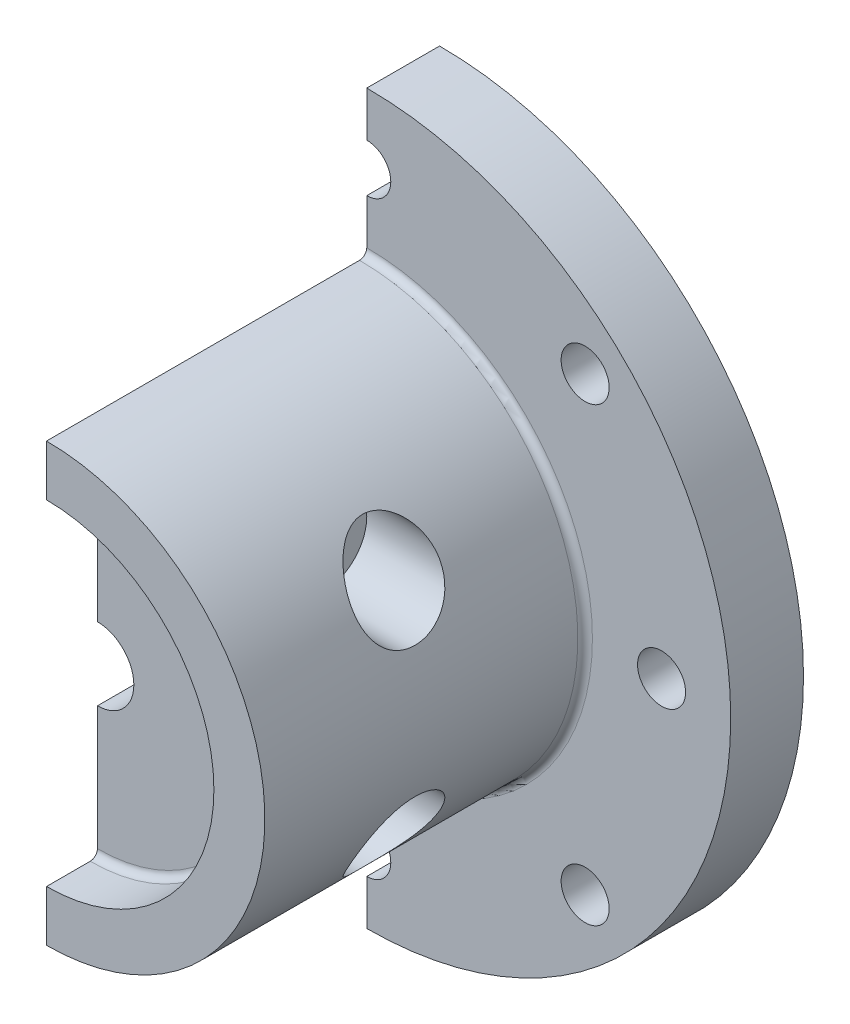
ISO-10303-21;
HEADER;
FILE_DESCRIPTION(('STEP AP214'),'2;1');
FILE_NAME('part.step','',(''),(''),'','','');
FILE_SCHEMA(('AUTOMOTIVE_DESIGN { 1 0 10303 214 1 1 1 1 }'));
ENDSEC;
DATA;
#1=APPLICATION_CONTEXT('core data for automotive mechanical design processes');
#2=APPLICATION_PROTOCOL_DEFINITION('international standard','automotive_design',2000,#1);
#3=PRODUCT_CONTEXT('',#1,'mechanical');
#4=PRODUCT('Part','Part','',(#3));
#5=PRODUCT_RELATED_PRODUCT_CATEGORY('part','',(#4));
#6=PRODUCT_DEFINITION_FORMATION('','',#4);
#7=PRODUCT_DEFINITION_CONTEXT('part definition',#1,'design');
#8=PRODUCT_DEFINITION('design','',#6,#7);
#9=PRODUCT_DEFINITION_SHAPE('','',#8);
#10=(LENGTH_UNIT() NAMED_UNIT(*) SI_UNIT(.MILLI.,.METRE.));
#11=(NAMED_UNIT(*) PLANE_ANGLE_UNIT() SI_UNIT($,.RADIAN.));
#12=(NAMED_UNIT(*) SI_UNIT($,.STERADIAN.) SOLID_ANGLE_UNIT());
#13=UNCERTAINTY_MEASURE_WITH_UNIT(LENGTH_MEASURE(1.E-05),#10,'distance_accuracy_value','');
#14=(GEOMETRIC_REPRESENTATION_CONTEXT(3) GLOBAL_UNCERTAINTY_ASSIGNED_CONTEXT((#13)) GLOBAL_UNIT_ASSIGNED_CONTEXT((#10,
#11,#12)) REPRESENTATION_CONTEXT('',''));
#15=CARTESIAN_POINT('',(0.,0.,0.));
#16=DIRECTION('',(0.,0.,1.));
#17=DIRECTION('',(1.,0.,0.));
#18=AXIS2_PLACEMENT_3D('',#15,#16,#17);
#19=CARTESIAN_POINT('',(0.,0.,22.));
#20=DIRECTION('',(0.,0.,-1.));
#21=DIRECTION('',(-1.,0.,0.));
#22=AXIS2_PLACEMENT_3D('',#19,#20,#21);
#23=CYLINDRICAL_SURFACE('',#22,15.);
#24=CARTESIAN_POINT('',(12.9903810567666,-7.5,8.));
#25=CARTESIAN_POINT('',(12.9264696091976,-7.61069865809604,7.99999904223033));
#26=CARTESIAN_POINT('',(12.8611447439549,-7.72056662722097,8.00612698311182));
#27=CARTESIAN_POINT('',(12.7282674607321,-7.93772137066509,8.0300942720911));
#28=CARTESIAN_POINT('',(12.6607137556231,-8.04500658936455,8.04794050390693));
#29=CARTESIAN_POINT('',(12.5239400195662,-8.25631894895201,8.0948799783041));
#30=CARTESIAN_POINT('',(12.4547167336951,-8.36033863067039,8.12399719441601));
#31=CARTESIAN_POINT('',(12.3154262096252,-8.56420031644843,8.1930326451005));
#32=CARTESIAN_POINT('',(12.2453586497343,-8.66404065878371,8.23295512967083));
#33=CARTESIAN_POINT('',(12.1119652707952,-8.84940869640308,8.31886342067213));
#34=CARTESIAN_POINT('',(12.0486440869453,-8.93538582322869,8.3638868289525));
#35=CARTESIAN_POINT('',(11.9226224737001,-9.10286185968748,8.46223155120769));
#36=CARTESIAN_POINT('',(11.859921976043,-9.1843612663605,8.51555194166533));
#37=CARTESIAN_POINT('',(11.6739073416291,-9.42124636718512,8.68767168482254));
#38=CARTESIAN_POINT('',(11.5523697407225,-9.56944588896759,8.81882645659967));
#39=CARTESIAN_POINT('',(11.3499893329127,-9.80795705894708,9.07742805522252));
#40=CARTESIAN_POINT('',(11.2664601600767,-9.90356447235861,9.19794758181675));
#41=CARTESIAN_POINT('',(11.1109238810263,-10.0777438857431,9.4574198087656));
#42=CARTESIAN_POINT('',(11.0388994161505,-10.1563416152798,9.59634414866977));
#43=CARTESIAN_POINT('',(10.9259369507483,-10.2776091093912,9.85936259114886));
#44=CARTESIAN_POINT('',(10.8816448396185,-10.3243749559963,9.98011254517485));
#45=CARTESIAN_POINT('',(10.8068816805062,-10.4026078769306,10.2305669937711));
#46=CARTESIAN_POINT('',(10.7763981004192,-10.4340888251323,10.3602632453147));
#47=CARTESIAN_POINT('',(10.7320081568901,-10.4797453743423,10.6265409946281));
#48=CARTESIAN_POINT('',(10.7182252431182,-10.4937921217714,10.7631660808401));
#49=CARTESIAN_POINT('',(10.7093013750171,-10.5029005467659,11.0376429123982));
#50=CARTESIAN_POINT('',(10.7141530050185,-10.4979697764865,11.17549414801));
#51=CARTESIAN_POINT('',(10.740288876905,-10.4712204824508,11.4319550281922));
#52=CARTESIAN_POINT('',(10.7596576858874,-10.4513697413144,11.5509810575344));
#53=CARTESIAN_POINT('',(10.8108498055628,-10.3984073931487,11.7832256337995));
#54=CARTESIAN_POINT('',(10.8426790909403,-10.3652894244271,11.8964413652375));
#55=CARTESIAN_POINT('',(10.9292144282833,-10.2741138227659,12.1526320359344));
#56=CARTESIAN_POINT('',(10.9880210294064,-10.2114013081412,12.2925605524142));
#57=CARTESIAN_POINT('',(11.1187585261655,-10.0688920270304,12.5567380768898));
#58=CARTESIAN_POINT('',(11.1907168424405,-9.98905950478929,12.6809533905421));
#59=CARTESIAN_POINT('',(11.3673760915886,-9.78804120627083,12.9496648150922));
#60=CARTESIAN_POINT('',(11.4752547823414,-9.66174777199417,13.0882420786634));
#61=CARTESIAN_POINT('',(11.6987595212769,-9.38989418393816,13.3371615783064));
#62=CARTESIAN_POINT('',(11.8143911370543,-9.2443201094048,13.4474832431815));
#63=CARTESIAN_POINT('',(12.0501678271282,-8.93486670731077,13.6410114260369));
#64=CARTESIAN_POINT('',(12.1703553769613,-8.770734030787,13.7237609405815));
#65=CARTESIAN_POINT('',(12.4092819864776,-8.42930745469143,13.858337004334));
#66=CARTESIAN_POINT('',(12.5280209800095,-8.25201295665694,13.9101621464536));
#67=CARTESIAN_POINT('',(12.7712641294712,-7.8708438522271,13.9838569089806));
#68=CARTESIAN_POINT('',(12.8953037004839,-7.66602078155735,14.0025566887012));
#69=CARTESIAN_POINT('',(13.0735667233716,-7.35502007481257,13.9982949504227));
#70=CARTESIAN_POINT('',(13.131718420433,-7.25066657941244,13.9914763773636));
#71=CARTESIAN_POINT('',(13.2449645987318,-7.04165978786301,13.9666439684654));
#72=CARTESIAN_POINT('',(13.3000610565447,-6.93700673271403,13.9486374648698));
#73=CARTESIAN_POINT('',(13.4018858206176,-6.73801217195145,13.9032441526991));
#74=CARTESIAN_POINT('',(13.4489196182572,-6.64359766220074,13.876858198747));
#75=CARTESIAN_POINT('',(13.5397419788571,-6.4564842157546,13.814390446123));
#76=CARTESIAN_POINT('',(13.5835324315613,-6.36378430404826,13.7783143510454));
#77=CARTESIAN_POINT('',(13.6675860423887,-6.18119644199398,13.6964350008791));
#78=CARTESIAN_POINT('',(13.707851476094,-6.09130670199598,13.6506380874665));
#79=CARTESIAN_POINT('',(13.7846543081797,-5.91544663532723,13.5494075294572));
#80=CARTESIAN_POINT('',(13.8211923269433,-5.82947565774778,13.4939754926766));
#81=CARTESIAN_POINT('',(13.8855768478133,-5.674223571749,13.3820969949688));
#82=CARTESIAN_POINT('',(13.9139261648006,-5.60428042547975,13.3268552438064));
#83=CARTESIAN_POINT('',(13.9676646699947,-5.46897079190085,13.2097342239032));
#84=CARTESIAN_POINT('',(13.9930542531375,-5.4036036944462,13.1478558428503));
#85=CARTESIAN_POINT('',(14.040830387683,-5.27821787042278,13.0178775869065));
#86=CARTESIAN_POINT('',(14.0632181870195,-5.21819692480016,12.9497803173161));
#87=CARTESIAN_POINT('',(14.1049926506369,-5.10420096553406,12.8078836514111));
#88=CARTESIAN_POINT('',(14.1243795046361,-5.05022556975356,12.7340846160019));
#89=CARTESIAN_POINT('',(14.1747574746296,-4.90772473991206,12.5191031908782));
#90=CARTESIAN_POINT('',(14.2023612796171,-4.82680613555144,12.371936734125));
#91=CARTESIAN_POINT('',(14.2480040905256,-4.69037361165972,12.065004393166));
#92=CARTESIAN_POINT('',(14.2660456447429,-4.63485292423952,11.905241878803));
#93=CARTESIAN_POINT('',(14.2923842734037,-4.55296962672859,11.5842669004372));
#94=CARTESIAN_POINT('',(14.3010313937239,-4.52556188534374,11.4233497500116));
#95=CARTESIAN_POINT('',(14.3099710294905,-4.49721708701322,11.0989804012515));
#96=CARTESIAN_POINT('',(14.3102642882491,-4.49627767496139,10.9355284297559));
#97=CARTESIAN_POINT('',(14.3025484779499,-4.52075874821271,10.6126419091109));
#98=CARTESIAN_POINT('',(14.2946313796176,-4.54588722741146,10.4531829125257));
#99=CARTESIAN_POINT('',(14.2704790596761,-4.62114422424302,10.1409444352998));
#100=CARTESIAN_POINT('',(14.2542441152416,-4.67127190882812,9.98816473226973));
#101=CARTESIAN_POINT('',(14.2131528215429,-4.79484194778865,9.69319250174782));
#102=CARTESIAN_POINT('',(14.1882773112151,-4.86833608799118,9.55102436459247));
#103=CARTESIAN_POINT('',(14.1296665451282,-5.03590824512795,9.28144123409604));
#104=CARTESIAN_POINT('',(14.0959313974867,-5.12998601086991,9.15402606074619));
#105=CARTESIAN_POINT('',(14.0188237473157,-5.33713133707824,8.91494578438045));
#106=CARTESIAN_POINT('',(13.9752931393476,-5.45050200504067,8.80359481032328));
#107=CARTESIAN_POINT('',(13.8790968249736,-5.69099518890866,8.60163031973628));
#108=CARTESIAN_POINT('',(13.8264284543281,-5.81812171144236,8.51102286918586));
#109=CARTESIAN_POINT('',(13.7097707158941,-6.08808585764112,8.34811131894618));
#110=CARTESIAN_POINT('',(13.6453657656456,-6.23138098605486,8.2768669552573));
#111=CARTESIAN_POINT('',(13.5080324859417,-6.5237342005856,8.15891771930024));
#112=CARTESIAN_POINT('',(13.4351071626084,-6.6727902418152,8.11220422392469));
#113=CARTESIAN_POINT('',(13.3009269745159,-6.93552204463718,8.05130411024427));
#114=CARTESIAN_POINT('',(13.2412387363235,-7.04884277300181,8.03193324697216));
#115=CARTESIAN_POINT('',(13.1183103333277,-7.27505937830618,8.0062808041133));
#116=CARTESIAN_POINT('',(13.0550696961819,-7.38795519660852,8.00000096941658));
#117=CARTESIAN_POINT('',(12.9903810567666,-7.5,8.));
#118=B_SPLINE_CURVE_WITH_KNOTS('',3,(#24,#25,#26,#27,#28,#29,#30,#31,#32,#33,#34,#35,#36,#37,
#38,#39,#40,#41,#42,#43,#44,#45,#46,#47,#48,#49,#50,#51,#52,#53,#54,#55,#56,#57,#58,#59,#60,#61,
#62,#63,#64,#65,#66,#67,#68,#69,#70,#71,#72,#73,#74,#75,#76,#77,#78,#79,#80,#81,#82,#83,#84,#85,
#86,#87,#88,#89,#90,#91,#92,#93,#94,#95,#96,#97,#98,#99,#100,#101,#102,#103,#104,#105,#106,#107,
#108,#109,#110,#111,#112,#113,#114,#115,#116,#117),.UNSPECIFIED.,.T.,.F.,(4,2,2,2,2,2,2,2,2,2,2,
2,2,2,2,2,2,2,2,2,2,2,2,2,2,2,2,2,2,2,2,2,2,2,2,2,2,2,2,2,2,2,2,2,2,2,4),(0.,0.383306249571935,
0.766837867803598,1.15118978555171,1.5356930993178,1.88293788311244,2.23014404353492,
2.92288551203909,3.4463270546741,3.96897119598093,4.37796619268107,4.78658925350746,
5.19821474167886,5.60967643929799,5.97472284135426,6.33994449463818,6.82993323992509,
7.32095548816917,7.96649747876304,8.61250812208131,9.26874775791276,9.92501725099248,
10.6412524790481,10.9997679024094,11.3580486126912,11.6837785793922,12.0093172407394,
12.334644176058,12.6599168759939,12.940121409741,13.2202885111273,13.5003387749033,
13.7803713268009,14.2881752747518,14.795843827124,15.2838683330309,15.7718494152243,
16.2544226708373,16.736979846752,17.2206140320077,17.7042423155633,18.1963216919713,
18.688544782703,19.2038900000059,19.7190539413419,20.1069696651076,20.4949370904648),.UNSPECIFIED.);
#119=CARTESIAN_POINT('',(12.9903810567666,-7.5,8.));
#120=VERTEX_POINT('',#119);
#121=EDGE_CURVE('E242',#120,#120,#118,.T.);
#122=ORIENTED_EDGE('',*,*,#121,.T.);
#123=EDGE_LOOP('',(#122));
#124=FACE_BOUND('',#123,.T.);
#125=CARTESIAN_POINT('',(12.9903810567666,7.5,8.));
#126=CARTESIAN_POINT('',(13.0897072890688,7.32794683022545,8.00000731726823));
#127=CARTESIAN_POINT('',(13.1857488548563,7.15364060366365,8.01483463142387));
#128=CARTESIAN_POINT('',(13.3688178266507,6.80540624080642,8.076153882193));
#129=CARTESIAN_POINT('',(13.4558262954186,6.63147961846495,8.12271085236512));
#130=CARTESIAN_POINT('',(13.619054282612,6.28946624632223,8.24900928430615));
#131=CARTESIAN_POINT('',(13.6952224659699,6.12140995344244,8.32890202741487));
#132=CARTESIAN_POINT('',(13.8346586508016,5.79939730597725,8.5214793253601));
#133=CARTESIAN_POINT('',(13.897940073223,5.64542637518981,8.63412946488523));
#134=CARTESIAN_POINT('',(14.0052251126522,5.37335697420597,8.87696511738657));
#135=CARTESIAN_POINT('',(14.050520043856,5.25321379993871,9.00429254064011));
#136=CARTESIAN_POINT('',(14.1299455608922,5.03568110046933,9.28013364535243));
#137=CARTESIAN_POINT('',(14.1640799680763,4.93828379037769,9.4286400500844));
#138=CARTESIAN_POINT('',(14.2193256523435,4.77677264508816,9.73066713065425));
#139=CARTESIAN_POINT('',(14.2412063441553,4.71074665630539,9.88302828549729));
#140=CARTESIAN_POINT('',(14.275890075802,4.60457469146692,10.1974851611016));
#141=CARTESIAN_POINT('',(14.2886950528515,4.56442319265829,10.3595787964441));
#142=CARTESIAN_POINT('',(14.3052366995496,4.51230900289111,10.6839064730001));
#143=CARTESIAN_POINT('',(14.3092218575303,4.49957416977278,10.8460043539306));
#144=CARTESIAN_POINT('',(14.3089473736099,4.50044749153358,11.1701181784238));
#145=CARTESIAN_POINT('',(14.3046882819421,4.51405388836011,11.332134126733));
#146=CARTESIAN_POINT('',(14.2878929083901,4.56693180185251,11.6503478071118));
#147=CARTESIAN_POINT('',(14.2754124958651,4.60603006604417,11.8065773449296));
#148=CARTESIAN_POINT('',(14.2420070579645,4.70830201094554,12.109976924927));
#149=CARTESIAN_POINT('',(14.2210822551953,4.77147505700623,12.2571472058039));
#150=CARTESIAN_POINT('',(14.170377832769,4.92001574291088,12.5392309628377));
#151=CARTESIAN_POINT('',(14.1405490186671,5.00550634858234,12.6740707601465));
#152=CARTESIAN_POINT('',(14.0718954670296,5.19537479905361,12.9271038040358));
#153=CARTESIAN_POINT('',(14.0330703610028,5.29975341747458,13.0452963684209));
#154=CARTESIAN_POINT('',(13.9454076985568,5.52636185577843,13.265005259634));
#155=CARTESIAN_POINT('',(13.8963530556128,5.64895864404431,13.3660556039868));
#156=CARTESIAN_POINT('',(13.7891810162305,5.90574616293324,13.5461680313127));
#157=CARTESIAN_POINT('',(13.7310618856394,6.03993910985511,13.6252258987698));
#158=CARTESIAN_POINT('',(13.602851729383,6.32360561867815,13.7645033862056));
#159=CARTESIAN_POINT('',(13.5322638779849,6.47351412162306,13.8233752578103));
#160=CARTESIAN_POINT('',(13.3828851788269,6.7769481828969,13.9158858342173));
#161=CARTESIAN_POINT('',(13.3040910164994,6.93047518323194,13.9495142977267));
#162=CARTESIAN_POINT('',(13.1313583246425,7.25287151492133,13.9946698698594));
#163=CARTESIAN_POINT('',(13.0366945859054,7.42171300422813,14.003601010271));
#164=CARTESIAN_POINT('',(12.8412689810592,7.75494676261363,13.9937977057122));
#165=CARTESIAN_POINT('',(12.7405049625759,7.91933743134324,13.9750534407702));
#166=CARTESIAN_POINT('',(12.5218392768693,8.2613474792931,13.9076699713646));
#167=CARTESIAN_POINT('',(12.4034072023098,8.43792611774708,13.8554762913328));
#168=CARTESIAN_POINT('',(12.1649777352769,8.77818440755714,13.7202617100278));
#169=CARTESIAN_POINT('',(12.0449783118163,8.94184487119229,13.6371959607354));
#170=CARTESIAN_POINT('',(11.8616118337846,9.1822465614854,13.4859850530983));
#171=CARTESIAN_POINT('',(11.7972074590153,9.26478681221123,13.4281176479739));
#172=CARTESIAN_POINT('',(11.6700858148128,9.42441184411173,13.3036698874787));
#173=CARTESIAN_POINT('',(11.6073689545644,9.50149530939698,13.2370874414526));
#174=CARTESIAN_POINT('',(11.4233541423012,9.72334890315659,13.024493960935));
#175=CARTESIAN_POINT('',(11.3057793636759,9.85925611669059,12.8653057622489));
#176=CARTESIAN_POINT('',(11.1302012511657,10.0563131668292,12.5760628116977));
#177=CARTESIAN_POINT('',(11.0659580051095,10.1267913971889,12.4560417544368));
#178=CARTESIAN_POINT('',(10.9499921409728,10.2520687107737,12.2025037530532));
#179=CARTESIAN_POINT('',(10.8982478663135,10.3068949441528,12.069010728913));
#180=CARTESIAN_POINT('',(10.8187549520099,10.390251705286,11.8132995506244));
#181=CARTESIAN_POINT('',(10.7884666272758,10.4216155261839,11.692804876081));
#182=CARTESIAN_POINT('',(10.7422167782432,10.4692837378933,11.4461885010933));
#183=CARTESIAN_POINT('',(10.7262451467948,10.4855987529404,11.3200708364425));
#184=CARTESIAN_POINT('',(10.7101774154995,10.502011588304,11.0653153781125));
#185=CARTESIAN_POINT('',(10.7101353165908,10.5020542455122,10.9366704906216));
#186=CARTESIAN_POINT('',(10.7260684769991,10.4857795377459,10.6814308456723));
#187=CARTESIAN_POINT('',(10.7420476775651,10.4694581472061,10.5548366004599));
#188=CARTESIAN_POINT('',(10.7872951001093,10.4228228528904,10.3133247852416));
#189=CARTESIAN_POINT('',(10.8158890271976,10.3932177804346,10.198138395387));
#190=CARTESIAN_POINT('',(10.8839663784715,10.3219041205505,9.97501139721393));
#191=CARTESIAN_POINT('',(10.9234552717404,10.2801894537665,9.86707446192178));
#192=CARTESIAN_POINT('',(11.0312382554518,10.1646696334611,9.61176351797143));
#193=CARTESIAN_POINT('',(11.1044216268816,10.0849340785569,9.46912965828802));
#194=CARTESIAN_POINT('',(11.2629560508894,9.90757492041095,9.20297996949168));
#195=CARTESIAN_POINT('',(11.3483341011125,9.8099114862653,9.07950786276453));
#196=CARTESIAN_POINT('',(11.5512142306093,9.57080301769698,8.82034816411075));
#197=CARTESIAN_POINT('',(11.6710594202175,9.42472700791979,8.69076658102644));
#198=CARTESIAN_POINT('',(11.9158344959457,9.11329973722681,8.46337262906356));
#199=CARTESIAN_POINT('',(12.0407699373166,8.94792702907341,8.36559607564493));
#200=CARTESIAN_POINT('',(12.2918049638232,8.59988776606397,8.20221802183295));
#201=CARTESIAN_POINT('',(12.4179034974285,8.41706275206546,8.13695308246291));
#202=CARTESIAN_POINT('',(12.6653676155777,8.03983587234968,8.04261329010554));
#203=CARTESIAN_POINT('',(12.7867479588244,7.84547589343658,8.01341499695506));
#204=CARTESIAN_POINT('',(12.9329305891617,7.59885782436222,8.00122357560307));
#205=CARTESIAN_POINT('',(12.9617918848593,7.54952224134407,7.99999789386313));
#206=CARTESIAN_POINT('',(12.9903810567666,7.5,8.));
#207=B_SPLINE_CURVE_WITH_KNOTS('',3,(#125,#126,#127,#128,#129,#130,#131,#132,#133,#134,#135,
#136,#137,#138,#139,#140,#141,#142,#143,#144,#145,#146,#147,#148,#149,#150,#151,#152,#153,#154,
#155,#156,#157,#158,#159,#160,#161,#162,#163,#164,#165,#166,#167,#168,#169,#170,#171,#172,#173,
#174,#175,#176,#177,#178,#179,#180,#181,#182,#183,#184,#185,#186,#187,#188,#189,#190,#191,#192,
#193,#194,#195,#196,#197,#198,#199,#200,#201,#202,#203,#204,#205,#206),.UNSPECIFIED.,.T.,.F.,(4,
2,2,2,2,2,2,2,2,2,2,2,2,2,2,2,2,2,2,2,2,2,2,2,2,2,2,2,2,2,2,2,2,2,2,2,2,2,2,2,4),(0.,
0.595848677644387,1.19292230274729,1.79273550040413,2.39192078999883,2.93151630931699,
3.47092687773842,3.97091829231864,4.47080295138583,4.95641437300083,5.44199338530921,
5.92430614262719,6.40660618630337,6.89162186331378,7.37665741024731,7.8732832997904,
8.37000431705066,8.89534304636034,9.42089479145619,9.99990322828195,10.5791171621158,
11.2332797858048,11.8883964533163,12.2468436438424,12.6053769805697,13.3202179277172,
13.7786302805756,14.2362425657494,14.619058540202,15.0016040448871,15.3854463630017,
15.769383129723,16.1349011426703,16.500602974184,17.0347823530973,17.5701632228924,
18.2539951153051,18.9385944222413,19.6301406294843,20.3193133627314,20.4908171022877),.UNSPECIFIED.);
#208=CARTESIAN_POINT('',(12.9903810567666,7.5,8.));
#209=VERTEX_POINT('',#208);
#210=EDGE_CURVE('E234',#209,#209,#207,.T.);
#211=ORIENTED_EDGE('',*,*,#210,.T.);
#212=EDGE_LOOP('',(#211));
#213=FACE_BOUND('',#212,.T.);
#214=DIRECTION('',(0.,0.,-1.));
#215=VECTOR('',#214,1.);
#216=CARTESIAN_POINT('',(0.,15.,22.));
#217=LINE('',#216,#215);
#218=CARTESIAN_POINT('',(0.,15.,22.));
#219=VERTEX_POINT('',#218);
#220=CARTESIAN_POINT('',(0.,15.,0.5));
#221=VERTEX_POINT('',#220);
#222=EDGE_CURVE('E307',#219,#221,#217,.T.);
#223=ORIENTED_EDGE('',*,*,#222,.F.);
#224=CARTESIAN_POINT('',(0.,0.,22.));
#225=DIRECTION('',(0.,0.,1.));
#226=DIRECTION('',(1.,0.,0.));
#227=AXIS2_PLACEMENT_3D('',#224,#225,#226);
#228=CIRCLE('',#227,15.);
#229=CARTESIAN_POINT('',(0.,-15.,22.));
#230=VERTEX_POINT('',#229);
#231=EDGE_CURVE('E219',#230,#219,#228,.T.);
#232=ORIENTED_EDGE('',*,*,#231,.F.);
#233=DIRECTION('',(0.,0.,-1.));
#234=VECTOR('',#233,1.);
#235=CARTESIAN_POINT('',(0.,-15.,22.));
#236=LINE('',#235,#234);
#237=CARTESIAN_POINT('',(0.,-15.,0.5));
#238=VERTEX_POINT('',#237);
#239=EDGE_CURVE('E322',#238,#230,#236,.F.);
#240=ORIENTED_EDGE('',*,*,#239,.F.);
#241=CARTESIAN_POINT('',(0.,0.,0.5));
#242=DIRECTION('',(0.,0.,-1.));
#243=DIRECTION('',(-1.,0.,0.));
#244=AXIS2_PLACEMENT_3D('',#241,#242,#243);
#245=CIRCLE('',#244,15.);
#246=EDGE_CURVE('E231',#238,#221,#245,.F.);
#247=ORIENTED_EDGE('',*,*,#246,.T.);
#248=EDGE_LOOP('',(#223,#232,#240,#247));
#249=FACE_BOUND('',#248,.T.);
#250=ADVANCED_FACE('F43',(#124,#213,#249),#23,.T.);
#251=CARTESIAN_POINT('',(-15.,-7.5,11.));
#252=DIRECTION('',(1.,0.,0.));
#253=DIRECTION('',(0.,0.,-1.));
#254=AXIS2_PLACEMENT_3D('',#251,#252,#253);
#255=CYLINDRICAL_SURFACE('',#254,1.65);
#256=CARTESIAN_POINT('',(8.,-7.5,11.));
#257=DIRECTION('',(-1.,0.,0.));
#258=DIRECTION('',(0.,0.,1.));
#259=AXIS2_PLACEMENT_3D('',#256,#257,#258);
#260=CIRCLE('',#259,1.65);
#261=CARTESIAN_POINT('',(8.,-7.5,12.65));
#262=VERTEX_POINT('',#261);
#263=EDGE_CURVE('E213',#262,#262,#260,.F.);
#264=ORIENTED_EDGE('',*,*,#263,.T.);
#265=EDGE_LOOP('',(#264));
#266=FACE_BOUND('',#265,.T.);
#267=CARTESIAN_POINT('',(0.,-7.5,11.));
#268=DIRECTION('',(-1.,0.,0.));
#269=DIRECTION('',(0.,0.,1.));
#270=AXIS2_PLACEMENT_3D('',#267,#268,#269);
#271=CIRCLE('',#270,1.65);
#272=CARTESIAN_POINT('',(0.,-7.5,12.65));
#273=VERTEX_POINT('',#272);
#274=EDGE_CURVE('E339',#273,#273,#271,.F.);
#275=ORIENTED_EDGE('',*,*,#274,.F.);
#276=EDGE_LOOP('',(#275));
#277=FACE_BOUND('',#276,.T.);
#278=ADVANCED_FACE('F271',(#266,#277),#255,.F.);
#279=CARTESIAN_POINT('',(-15.,7.5,11.));
#280=DIRECTION('',(1.,0.,0.));
#281=DIRECTION('',(0.,0.,-1.));
#282=AXIS2_PLACEMENT_3D('',#279,#280,#281);
#283=CYLINDRICAL_SURFACE('',#282,1.65);
#284=CARTESIAN_POINT('',(8.,7.5,11.));
#285=DIRECTION('',(1.,0.,0.));
#286=DIRECTION('',(0.,0.,-1.));
#287=AXIS2_PLACEMENT_3D('',#284,#285,#286);
#288=CIRCLE('',#287,1.65);
#289=CARTESIAN_POINT('',(8.,7.5,9.35));
#290=VERTEX_POINT('',#289);
#291=EDGE_CURVE('E238',#290,#290,#288,.F.);
#292=ORIENTED_EDGE('',*,*,#291,.F.);
#293=EDGE_LOOP('',(#292));
#294=FACE_BOUND('',#293,.T.);
#295=CARTESIAN_POINT('',(0.,7.5,11.));
#296=DIRECTION('',(-1.,0.,0.));
#297=DIRECTION('',(0.,0.,1.));
#298=AXIS2_PLACEMENT_3D('',#295,#296,#297);
#299=CIRCLE('',#298,1.65);
#300=CARTESIAN_POINT('',(0.,7.5,12.65));
#301=VERTEX_POINT('',#300);
#302=EDGE_CURVE('E378',#301,#301,#299,.F.);
#303=ORIENTED_EDGE('',*,*,#302,.F.);
#304=EDGE_LOOP('',(#303));
#305=FACE_BOUND('',#304,.T.);
#306=ADVANCED_FACE('F274',(#294,#305),#283,.F.);
#307=CARTESIAN_POINT('',(0.,0.,22.));
#308=DIRECTION('',(0.,0.,1.));
#309=DIRECTION('',(1.,0.,0.));
#310=AXIS2_PLACEMENT_3D('',#307,#308,#309);
#311=PLANE('',#310);
#312=ORIENTED_EDGE('',*,*,#231,.T.);
#313=DIRECTION('',(0.,-1.,0.));
#314=VECTOR('',#313,1.);
#315=CARTESIAN_POINT('',(0.,0.,22.));
#316=LINE('',#315,#314);
#317=CARTESIAN_POINT('',(0.,11.5,22.));
#318=VERTEX_POINT('',#317);
#319=EDGE_CURVE('E312',#219,#318,#316,.T.);
#320=ORIENTED_EDGE('',*,*,#319,.T.);
#321=CARTESIAN_POINT('',(0.,0.,22.));
#322=DIRECTION('',(0.,0.,1.));
#323=DIRECTION('',(1.,0.,0.));
#324=AXIS2_PLACEMENT_3D('',#321,#322,#323);
#325=CIRCLE('',#324,11.5);
#326=CARTESIAN_POINT('',(0.,-11.5,22.));
#327=VERTEX_POINT('',#326);
#328=EDGE_CURVE('E215',#327,#318,#325,.T.);
#329=ORIENTED_EDGE('',*,*,#328,.F.);
#330=DIRECTION('',(0.,-1.,0.));
#331=VECTOR('',#330,1.);
#332=CARTESIAN_POINT('',(0.,0.,22.));
#333=LINE('',#332,#331);
#334=EDGE_CURVE('E317',#327,#230,#333,.T.);
#335=ORIENTED_EDGE('',*,*,#334,.T.);
#336=EDGE_LOOP('',(#312,#320,#329,#335));
#337=FACE_BOUND('',#336,.T.);
#338=ADVANCED_FACE('F278',(#337),#311,.T.);
#339=CARTESIAN_POINT('',(0.,0.,18.5));
#340=DIRECTION('',(0.,0.,1.));
#341=DIRECTION('',(1.,0.,0.));
#342=AXIS2_PLACEMENT_3D('',#339,#340,#341);
#343=CYLINDRICAL_SURFACE('',#342,11.5);
#344=DIRECTION('',(0.,0.,1.));
#345=VECTOR('',#344,1.);
#346=CARTESIAN_POINT('',(0.,11.5,18.5));
#347=LINE('',#346,#345);
#348=CARTESIAN_POINT('',(0.,11.5,19.));
#349=VERTEX_POINT('',#348);
#350=EDGE_CURVE('E392',#349,#318,#347,.T.);
#351=ORIENTED_EDGE('',*,*,#350,.F.);
#352=CARTESIAN_POINT('',(0.,0.,19.));
#353=DIRECTION('',(0.,0.,1.));
#354=DIRECTION('',(1.,0.,0.));
#355=AXIS2_PLACEMENT_3D('',#352,#353,#354);
#356=CIRCLE('',#355,11.5);
#357=CARTESIAN_POINT('',(0.,-11.5,19.));
#358=VERTEX_POINT('',#357);
#359=EDGE_CURVE('E227',#349,#358,#356,.F.);
#360=ORIENTED_EDGE('',*,*,#359,.T.);
#361=DIRECTION('',(0.,0.,1.));
#362=VECTOR('',#361,1.);
#363=CARTESIAN_POINT('',(0.,-11.5,18.5));
#364=LINE('',#363,#362);
#365=EDGE_CURVE('E321',#327,#358,#364,.F.);
#366=ORIENTED_EDGE('',*,*,#365,.F.);
#367=ORIENTED_EDGE('',*,*,#328,.T.);
#368=EDGE_LOOP('',(#351,#360,#366,#367));
#369=FACE_BOUND('',#368,.T.);
#370=ADVANCED_FACE('F287',(#369),#343,.F.);
#371=CARTESIAN_POINT('',(0.,0.,18.5));
#372=DIRECTION('',(0.,0.,1.));
#373=DIRECTION('',(1.,0.,0.));
#374=AXIS2_PLACEMENT_3D('',#371,#372,#373);
#375=PLANE('',#374);
#376=CARTESIAN_POINT('',(0.,0.,18.5));
#377=DIRECTION('',(0.,0.,1.));
#378=DIRECTION('',(1.,0.,0.));
#379=AXIS2_PLACEMENT_3D('',#376,#377,#378);
#380=CIRCLE('',#379,11.);
#381=CARTESIAN_POINT('',(0.,-11.,18.5));
#382=VERTEX_POINT('',#381);
#383=CARTESIAN_POINT('',(0.,11.,18.5));
#384=VERTEX_POINT('',#383);
#385=EDGE_CURVE('E223',#382,#384,#380,.T.);
#386=ORIENTED_EDGE('',*,*,#385,.T.);
#387=DIRECTION('',(0.,-1.,0.));
#388=VECTOR('',#387,1.);
#389=CARTESIAN_POINT('',(0.,0.,18.5));
#390=LINE('',#389,#388);
#391=CARTESIAN_POINT('',(0.,2.5,18.5));
#392=VERTEX_POINT('',#391);
#393=EDGE_CURVE('E386',#384,#392,#390,.T.);
#394=ORIENTED_EDGE('',*,*,#393,.T.);
#395=CARTESIAN_POINT('',(0.,0.,18.5));
#396=DIRECTION('',(0.,0.,1.));
#397=DIRECTION('',(1.,0.,0.));
#398=AXIS2_PLACEMENT_3D('',#395,#396,#397);
#399=CIRCLE('',#398,2.5);
#400=CARTESIAN_POINT('',(0.,-2.5,18.5));
#401=VERTEX_POINT('',#400);
#402=EDGE_CURVE('E151',#401,#392,#399,.T.);
#403=ORIENTED_EDGE('',*,*,#402,.F.);
#404=DIRECTION('',(0.,-1.,0.));
#405=VECTOR('',#404,1.);
#406=CARTESIAN_POINT('',(0.,0.,18.5));
#407=LINE('',#406,#405);
#408=EDGE_CURVE('E334',#401,#382,#407,.T.);
#409=ORIENTED_EDGE('',*,*,#408,.T.);
#410=EDGE_LOOP('',(#386,#394,#403,#409));
#411=FACE_BOUND('',#410,.T.);
#412=ADVANCED_FACE('F284',(#411),#375,.T.);
#413=CARTESIAN_POINT('',(0.,0.,19.));
#414=DIRECTION('',(0.,0.,1.));
#415=DIRECTION('',(1.,0.,0.));
#416=AXIS2_PLACEMENT_3D('',#413,#414,#415);
#417=TOROIDAL_SURFACE('',#416,11.,0.5);
#418=CARTESIAN_POINT('',(0.,11.,19.));
#419=DIRECTION('',(-1.,0.,0.));
#420=DIRECTION('',(0.,0.,1.));
#421=AXIS2_PLACEMENT_3D('',#418,#419,#420);
#422=CIRCLE('',#421,0.5);
#423=EDGE_CURVE('E389',#384,#349,#422,.F.);
#424=ORIENTED_EDGE('',*,*,#423,.F.);
#425=ORIENTED_EDGE('',*,*,#385,.F.);
#426=CARTESIAN_POINT('',(0.,-11.,19.));
#427=DIRECTION('',(-1.,0.,0.));
#428=DIRECTION('',(0.,0.,1.));
#429=AXIS2_PLACEMENT_3D('',#426,#427,#428);
#430=CIRCLE('',#429,0.5);
#431=EDGE_CURVE('E326',#358,#382,#430,.F.);
#432=ORIENTED_EDGE('',*,*,#431,.F.);
#433=ORIENTED_EDGE('',*,*,#359,.F.);
#434=EDGE_LOOP('',(#424,#425,#432,#433));
#435=FACE_BOUND('',#434,.T.);
#436=ADVANCED_FACE('F283',(#435),#417,.F.);
#437=CARTESIAN_POINT('',(0.,0.,30.));
#438=DIRECTION('',(0.,0.,-1.));
#439=DIRECTION('',(-1.,0.,0.));
#440=AXIS2_PLACEMENT_3D('',#437,#438,#439);
#441=CYLINDRICAL_SURFACE('',#440,2.5);
#442=ORIENTED_EDGE('',*,*,#402,.T.);
#443=DIRECTION('',(0.,0.,1.));
#444=VECTOR('',#443,1.);
#445=CARTESIAN_POINT('',(0.,2.5,-31.5));
#446=LINE('',#445,#444);
#447=CARTESIAN_POINT('',(0.,2.5,-5.));
#448=VERTEX_POINT('',#447);
#449=EDGE_CURVE('E144',#448,#392,#446,.T.);
#450=ORIENTED_EDGE('',*,*,#449,.F.);
#451=CARTESIAN_POINT('',(0.,0.,-5.));
#452=DIRECTION('',(0.,0.,-1.));
#453=DIRECTION('',(-1.,0.,0.));
#454=AXIS2_PLACEMENT_3D('',#451,#452,#453);
#455=CIRCLE('',#454,2.5);
#456=CARTESIAN_POINT('',(0.,-2.5,-5.));
#457=VERTEX_POINT('',#456);
#458=EDGE_CURVE('E148',#448,#457,#455,.T.);
#459=ORIENTED_EDGE('',*,*,#458,.T.);
#460=DIRECTION('',(0.,0.,1.));
#461=VECTOR('',#460,1.);
#462=CARTESIAN_POINT('',(0.,-2.5,-31.5));
#463=LINE('',#462,#461);
#464=EDGE_CURVE('E156',#457,#401,#463,.T.);
#465=ORIENTED_EDGE('',*,*,#464,.T.);
#466=EDGE_LOOP('',(#442,#450,#459,#465));
#467=FACE_BOUND('',#466,.T.);
#468=ADVANCED_FACE('F146',(#467),#441,.F.);
#469=CARTESIAN_POINT('',(0.,0.,0.));
#470=DIRECTION('',(0.,0.,-1.));
#471=DIRECTION('',(-1.,0.,0.));
#472=AXIS2_PLACEMENT_3D('',#469,#470,#471);
#473=PLANE('',#472);
#474=CARTESIAN_POINT('',(15.,15.5,0.));
#475=DIRECTION('',(0.,0.,1.));
#476=DIRECTION('',(1.,0.,0.));
#477=AXIS2_PLACEMENT_3D('',#474,#475,#476);
#478=CIRCLE('',#477,1.65);
#479=CARTESIAN_POINT('',(16.65,15.5,0.));
#480=VERTEX_POINT('',#479);
#481=EDGE_CURVE('E353',#480,#480,#478,.T.);
#482=ORIENTED_EDGE('',*,*,#481,.F.);
#483=EDGE_LOOP('',(#482));
#484=FACE_BOUND('',#483,.T.);
#485=CARTESIAN_POINT('',(20.25,0.,0.));
#486=DIRECTION('',(0.,0.,1.));
#487=DIRECTION('',(1.,0.,0.));
#488=AXIS2_PLACEMENT_3D('',#485,#486,#487);
#489=CIRCLE('',#488,1.65);
#490=CARTESIAN_POINT('',(21.9,0.,0.));
#491=VERTEX_POINT('',#490);
#492=EDGE_CURVE('E349',#491,#491,#489,.T.);
#493=ORIENTED_EDGE('',*,*,#492,.F.);
#494=EDGE_LOOP('',(#493));
#495=FACE_BOUND('',#494,.T.);
#496=CARTESIAN_POINT('',(15.,-15.5,0.));
#497=DIRECTION('',(0.,0.,1.));
#498=DIRECTION('',(1.,0.,0.));
#499=AXIS2_PLACEMENT_3D('',#496,#497,#498);
#500=CIRCLE('',#499,1.65);
#501=CARTESIAN_POINT('',(16.65,-15.5,0.));
#502=VERTEX_POINT('',#501);
#503=EDGE_CURVE('E343',#502,#502,#500,.T.);
#504=ORIENTED_EDGE('',*,*,#503,.F.);
#505=EDGE_LOOP('',(#504));
#506=FACE_BOUND('',#505,.T.);
#507=DIRECTION('',(0.,1.,0.));
#508=VECTOR('',#507,1.);
#509=CARTESIAN_POINT('',(0.,0.,0.));
#510=LINE('',#509,#508);
#511=CARTESIAN_POINT('',(0.,15.5,0.));
#512=VERTEX_POINT('',#511);
#513=CARTESIAN_POINT('',(0.,18.6,0.));
#514=VERTEX_POINT('',#513);
#515=EDGE_CURVE('E66',#512,#514,#510,.T.);
#516=ORIENTED_EDGE('',*,*,#515,.F.);
#517=CARTESIAN_POINT('',(0.,0.,0.));
#518=DIRECTION('',(0.,0.,-1.));
#519=DIRECTION('',(-1.,0.,0.));
#520=AXIS2_PLACEMENT_3D('',#517,#518,#519);
#521=CIRCLE('',#520,15.5);
#522=CARTESIAN_POINT('',(0.,-15.5,0.));
#523=VERTEX_POINT('',#522);
#524=EDGE_CURVE('E372',#512,#523,#521,.T.);
#525=ORIENTED_EDGE('',*,*,#524,.T.);
#526=DIRECTION('',(0.,1.,0.));
#527=VECTOR('',#526,1.);
#528=CARTESIAN_POINT('',(0.,0.,0.));
#529=LINE('',#528,#527);
#530=CARTESIAN_POINT('',(0.,-18.6,0.));
#531=VERTEX_POINT('',#530);
#532=EDGE_CURVE('E370',#531,#523,#529,.T.);
#533=ORIENTED_EDGE('',*,*,#532,.F.);
#534=CARTESIAN_POINT('',(0.,-20.25,0.));
#535=DIRECTION('',(0.,0.,1.));
#536=DIRECTION('',(-1.,0.,0.));
#537=AXIS2_PLACEMENT_3D('',#534,#535,#536);
#538=CIRCLE('',#537,1.65);
#539=CARTESIAN_POINT('',(0.,-21.9,0.));
#540=VERTEX_POINT('',#539);
#541=EDGE_CURVE('E208',#540,#531,#538,.T.);
#542=ORIENTED_EDGE('',*,*,#541,.F.);
#543=CARTESIAN_POINT('',(0.,-25.,0.));
#544=VERTEX_POINT('',#543);
#545=EDGE_CURVE('E58',#544,#540,#529,.T.);
#546=ORIENTED_EDGE('',*,*,#545,.F.);
#547=CARTESIAN_POINT('',(0.,0.,0.));
#548=DIRECTION('',(0.,0.,-1.));
#549=DIRECTION('',(-1.,0.,0.));
#550=AXIS2_PLACEMENT_3D('',#547,#548,#549);
#551=CIRCLE('',#550,25.);
#552=CARTESIAN_POINT('',(0.,25.,0.));
#553=VERTEX_POINT('',#552);
#554=EDGE_CURVE('E199',#553,#544,#551,.T.);
#555=ORIENTED_EDGE('',*,*,#554,.F.);
#556=CARTESIAN_POINT('',(0.,21.9,0.));
#557=VERTEX_POINT('',#556);
#558=EDGE_CURVE('E174',#557,#553,#510,.T.);
#559=ORIENTED_EDGE('',*,*,#558,.F.);
#560=CARTESIAN_POINT('',(0.,20.25,0.));
#561=DIRECTION('',(0.,0.,1.));
#562=DIRECTION('',(1.,0.,0.));
#563=AXIS2_PLACEMENT_3D('',#560,#561,#562);
#564=CIRCLE('',#563,1.65);
#565=EDGE_CURVE('E344',#514,#557,#564,.T.);
#566=ORIENTED_EDGE('',*,*,#565,.F.);
#567=EDGE_LOOP('',(#516,#525,#533,#542,#546,#555,#559,#566));
#568=FACE_BOUND('',#567,.T.);
#569=ADVANCED_FACE('F282',(#484,#495,#506,#568),#473,.F.);
#570=CARTESIAN_POINT('',(0.,0.,-5.));
#571=DIRECTION('',(0.,0.,-1.));
#572=DIRECTION('',(-1.,0.,0.));
#573=AXIS2_PLACEMENT_3D('',#570,#571,#572);
#574=PLANE('',#573);
#575=ORIENTED_EDGE('',*,*,#458,.F.);
#576=DIRECTION('',(0.,1.,0.));
#577=VECTOR('',#576,1.);
#578=CARTESIAN_POINT('',(0.,0.,-5.));
#579=LINE('',#578,#577);
#580=CARTESIAN_POINT('',(0.,18.6,-5.));
#581=VERTEX_POINT('',#580);
#582=EDGE_CURVE('E163',#448,#581,#579,.T.);
#583=ORIENTED_EDGE('',*,*,#582,.T.);
#584=CARTESIAN_POINT('',(0.,20.25,-5.));
#585=DIRECTION('',(0.,0.,-1.));
#586=DIRECTION('',(-1.,0.,0.));
#587=AXIS2_PLACEMENT_3D('',#584,#585,#586);
#588=CIRCLE('',#587,1.65);
#589=CARTESIAN_POINT('',(0.,21.9,-5.));
#590=VERTEX_POINT('',#589);
#591=EDGE_CURVE('E187',#590,#581,#588,.T.);
#592=ORIENTED_EDGE('',*,*,#591,.F.);
#593=CARTESIAN_POINT('',(0.,25.,-5.));
#594=VERTEX_POINT('',#593);
#595=EDGE_CURVE('E155',#590,#594,#579,.T.);
#596=ORIENTED_EDGE('',*,*,#595,.T.);
#597=CARTESIAN_POINT('',(0.,0.,-5.));
#598=DIRECTION('',(0.,0.,-1.));
#599=DIRECTION('',(-1.,0.,0.));
#600=AXIS2_PLACEMENT_3D('',#597,#598,#599);
#601=CIRCLE('',#600,25.);
#602=CARTESIAN_POINT('',(0.,-25.,-5.));
#603=VERTEX_POINT('',#602);
#604=EDGE_CURVE('E186',#594,#603,#601,.T.);
#605=ORIENTED_EDGE('',*,*,#604,.T.);
#606=DIRECTION('',(0.,1.,0.));
#607=VECTOR('',#606,1.);
#608=CARTESIAN_POINT('',(0.,0.,-5.));
#609=LINE('',#608,#607);
#610=CARTESIAN_POINT('',(0.,-21.9,-5.));
#611=VERTEX_POINT('',#610);
#612=EDGE_CURVE('E338',#603,#611,#609,.T.);
#613=ORIENTED_EDGE('',*,*,#612,.T.);
#614=CARTESIAN_POINT('',(0.,-20.25,-5.));
#615=DIRECTION('',(0.,0.,-1.));
#616=DIRECTION('',(-1.,0.,0.));
#617=AXIS2_PLACEMENT_3D('',#614,#615,#616);
#618=CIRCLE('',#617,1.65);
#619=CARTESIAN_POINT('',(0.,-18.6,-5.));
#620=VERTEX_POINT('',#619);
#621=EDGE_CURVE('E411',#620,#611,#618,.T.);
#622=ORIENTED_EDGE('',*,*,#621,.F.);
#623=EDGE_CURVE('E166',#620,#457,#609,.T.);
#624=ORIENTED_EDGE('',*,*,#623,.T.);
#625=EDGE_LOOP('',(#575,#583,#592,#596,#605,#613,#622,#624));
#626=FACE_BOUND('',#625,.T.);
#627=CARTESIAN_POINT('',(15.,15.5,-5.));
#628=DIRECTION('',(0.,0.,-1.));
#629=DIRECTION('',(-1.,0.,0.));
#630=AXIS2_PLACEMENT_3D('',#627,#628,#629);
#631=CIRCLE('',#630,1.65);
#632=CARTESIAN_POINT('',(13.35,15.5,-5.));
#633=VERTEX_POINT('',#632);
#634=EDGE_CURVE('E348',#633,#633,#631,.T.);
#635=ORIENTED_EDGE('',*,*,#634,.F.);
#636=EDGE_LOOP('',(#635));
#637=FACE_BOUND('',#636,.T.);
#638=CARTESIAN_POINT('',(20.25,0.,-5.));
#639=DIRECTION('',(0.,0.,-1.));
#640=DIRECTION('',(-1.,0.,0.));
#641=AXIS2_PLACEMENT_3D('',#638,#639,#640);
#642=CIRCLE('',#641,1.65);
#643=CARTESIAN_POINT('',(18.6,0.,-5.));
#644=VERTEX_POINT('',#643);
#645=EDGE_CURVE('E414',#644,#644,#642,.T.);
#646=ORIENTED_EDGE('',*,*,#645,.F.);
#647=EDGE_LOOP('',(#646));
#648=FACE_BOUND('',#647,.T.);
#649=CARTESIAN_POINT('',(15.,-15.5,-5.));
#650=DIRECTION('',(0.,0.,-1.));
#651=DIRECTION('',(-1.,0.,0.));
#652=AXIS2_PLACEMENT_3D('',#649,#650,#651);
#653=CIRCLE('',#652,1.65);
#654=CARTESIAN_POINT('',(13.35,-15.5,-5.));
#655=VERTEX_POINT('',#654);
#656=EDGE_CURVE('E418',#655,#655,#653,.T.);
#657=ORIENTED_EDGE('',*,*,#656,.F.);
#658=EDGE_LOOP('',(#657));
#659=FACE_BOUND('',#658,.T.);
#660=ADVANCED_FACE('F160',(#626,#637,#648,#659),#574,.T.);
#661=CARTESIAN_POINT('',(0.,0.,-5.));
#662=DIRECTION('',(0.,0.,1.));
#663=DIRECTION('',(1.,0.,0.));
#664=AXIS2_PLACEMENT_3D('',#661,#662,#663);
#665=CYLINDRICAL_SURFACE('',#664,25.);
#666=DIRECTION('',(0.,0.,1.));
#667=VECTOR('',#666,1.);
#668=CARTESIAN_POINT('',(0.,-25.,-31.5));
#669=LINE('',#668,#667);
#670=EDGE_CURVE('E196',#603,#544,#669,.T.);
#671=ORIENTED_EDGE('',*,*,#670,.F.);
#672=ORIENTED_EDGE('',*,*,#604,.F.);
#673=DIRECTION('',(0.,0.,1.));
#674=VECTOR('',#673,1.);
#675=CARTESIAN_POINT('',(0.,25.,-31.5));
#676=LINE('',#675,#674);
#677=EDGE_CURVE('E168',#594,#553,#676,.T.);
#678=ORIENTED_EDGE('',*,*,#677,.T.);
#679=ORIENTED_EDGE('',*,*,#554,.T.);
#680=EDGE_LOOP('',(#671,#672,#678,#679));
#681=FACE_BOUND('',#680,.T.);
#682=ADVANCED_FACE('F193',(#681),#665,.T.);
#683=CARTESIAN_POINT('',(0.,0.,0.5));
#684=DIRECTION('',(0.,0.,-1.));
#685=DIRECTION('',(-1.,0.,0.));
#686=AXIS2_PLACEMENT_3D('',#683,#684,#685);
#687=TOROIDAL_SURFACE('',#686,15.5,0.5);
#688=CARTESIAN_POINT('',(0.,15.5,0.5));
#689=DIRECTION('',(-1.,0.,0.));
#690=DIRECTION('',(0.,0.,1.));
#691=AXIS2_PLACEMENT_3D('',#688,#689,#690);
#692=CIRCLE('',#691,0.5);
#693=EDGE_CURVE('E178',#221,#512,#692,.F.);
#694=ORIENTED_EDGE('',*,*,#693,.F.);
#695=ORIENTED_EDGE('',*,*,#246,.F.);
#696=CARTESIAN_POINT('',(0.,-15.5,0.5));
#697=DIRECTION('',(-1.,0.,0.));
#698=DIRECTION('',(0.,0.,1.));
#699=AXIS2_PLACEMENT_3D('',#696,#697,#698);
#700=CIRCLE('',#699,0.5);
#701=EDGE_CURVE('E328',#523,#238,#700,.F.);
#702=ORIENTED_EDGE('',*,*,#701,.F.);
#703=ORIENTED_EDGE('',*,*,#524,.F.);
#704=EDGE_LOOP('',(#694,#695,#702,#703));
#705=FACE_BOUND('',#704,.T.);
#706=ADVANCED_FACE('F45',(#705),#687,.F.);
#707=CARTESIAN_POINT('',(0.,-20.25,-20.));
#708=DIRECTION('',(0.,0.,1.));
#709=DIRECTION('',(1.,0.,0.));
#710=AXIS2_PLACEMENT_3D('',#707,#708,#709);
#711=CYLINDRICAL_SURFACE('',#710,1.65);
#712=DIRECTION('',(0.,0.,1.));
#713=VECTOR('',#712,1.);
#714=CARTESIAN_POINT('',(0.,-21.9,-20.));
#715=LINE('',#714,#713);
#716=EDGE_CURVE('E11',#540,#611,#715,.F.);
#717=ORIENTED_EDGE('',*,*,#716,.F.);
#718=ORIENTED_EDGE('',*,*,#541,.T.);
#719=DIRECTION('',(0.,0.,1.));
#720=VECTOR('',#719,1.);
#721=CARTESIAN_POINT('',(0.,-18.6,-20.));
#722=LINE('',#721,#720);
#723=EDGE_CURVE('E52',#620,#531,#722,.T.);
#724=ORIENTED_EDGE('',*,*,#723,.F.);
#725=ORIENTED_EDGE('',*,*,#621,.T.);
#726=EDGE_LOOP('',(#717,#718,#724,#725));
#727=FACE_BOUND('',#726,.T.);
#728=ADVANCED_FACE('F365',(#727),#711,.F.);
#729=CARTESIAN_POINT('',(0.,20.25,-20.));
#730=DIRECTION('',(0.,0.,1.));
#731=DIRECTION('',(1.,0.,0.));
#732=AXIS2_PLACEMENT_3D('',#729,#730,#731);
#733=CYLINDRICAL_SURFACE('',#732,1.65);
#734=DIRECTION('',(0.,0.,1.));
#735=VECTOR('',#734,1.);
#736=CARTESIAN_POINT('',(0.,18.6,-20.));
#737=LINE('',#736,#735);
#738=EDGE_CURVE('E172',#514,#581,#737,.F.);
#739=ORIENTED_EDGE('',*,*,#738,.F.);
#740=ORIENTED_EDGE('',*,*,#565,.T.);
#741=DIRECTION('',(0.,0.,1.));
#742=VECTOR('',#741,1.);
#743=CARTESIAN_POINT('',(0.,21.9,-20.));
#744=LINE('',#743,#742);
#745=EDGE_CURVE('E402',#590,#557,#744,.T.);
#746=ORIENTED_EDGE('',*,*,#745,.F.);
#747=ORIENTED_EDGE('',*,*,#591,.T.);
#748=EDGE_LOOP('',(#739,#740,#746,#747));
#749=FACE_BOUND('',#748,.T.);
#750=ADVANCED_FACE('F263',(#749),#733,.F.);
#751=CARTESIAN_POINT('',(8.,-7.5,11.));
#752=DIRECTION('',(1.,0.,0.));
#753=DIRECTION('',(0.,0.,-1.));
#754=AXIS2_PLACEMENT_3D('',#751,#752,#753);
#755=CYLINDRICAL_SURFACE('',#754,3.);
#756=CARTESIAN_POINT('',(8.,-7.5,11.));
#757=DIRECTION('',(1.,0.,0.));
#758=DIRECTION('',(0.,0.,1.));
#759=AXIS2_PLACEMENT_3D('',#756,#757,#758);
#760=CIRCLE('',#759,3.);
#761=CARTESIAN_POINT('',(8.,-7.5,14.));
#762=VERTEX_POINT('',#761);
#763=EDGE_CURVE('E198',#762,#762,#760,.T.);
#764=ORIENTED_EDGE('',*,*,#763,.F.);
#765=EDGE_LOOP('',(#764));
#766=FACE_BOUND('',#765,.T.);
#767=ORIENTED_EDGE('',*,*,#121,.F.);
#768=EDGE_LOOP('',(#767));
#769=FACE_BOUND('',#768,.T.);
#770=ADVANCED_FACE('F258',(#766,#769),#755,.F.);
#771=CARTESIAN_POINT('',(8.,-7.5,11.));
#772=DIRECTION('',(-1.,0.,0.));
#773=DIRECTION('',(0.,0.,1.));
#774=AXIS2_PLACEMENT_3D('',#771,#772,#773);
#775=PLANE('',#774);
#776=ORIENTED_EDGE('',*,*,#763,.T.);
#777=EDGE_LOOP('',(#776));
#778=FACE_BOUND('',#777,.T.);
#779=ORIENTED_EDGE('',*,*,#263,.F.);
#780=EDGE_LOOP('',(#779));
#781=FACE_BOUND('',#780,.T.);
#782=ADVANCED_FACE('F262',(#778,#781),#775,.F.);
#783=CARTESIAN_POINT('',(8.,7.5,11.));
#784=DIRECTION('',(1.,0.,0.));
#785=DIRECTION('',(0.,0.,-1.));
#786=AXIS2_PLACEMENT_3D('',#783,#784,#785);
#787=CYLINDRICAL_SURFACE('',#786,3.);
#788=CARTESIAN_POINT('',(8.,7.5,11.));
#789=DIRECTION('',(1.,0.,0.));
#790=DIRECTION('',(0.,0.,-1.));
#791=AXIS2_PLACEMENT_3D('',#788,#789,#790);
#792=CIRCLE('',#791,3.);
#793=CARTESIAN_POINT('',(8.,7.5,8.));
#794=VERTEX_POINT('',#793);
#795=EDGE_CURVE('E204',#794,#794,#792,.T.);
#796=ORIENTED_EDGE('',*,*,#795,.F.);
#797=EDGE_LOOP('',(#796));
#798=FACE_BOUND('',#797,.T.);
#799=ORIENTED_EDGE('',*,*,#210,.F.);
#800=EDGE_LOOP('',(#799));
#801=FACE_BOUND('',#800,.T.);
#802=ADVANCED_FACE('F265',(#798,#801),#787,.F.);
#803=CARTESIAN_POINT('',(8.,7.5,11.));
#804=DIRECTION('',(1.,0.,0.));
#805=DIRECTION('',(0.,0.,-1.));
#806=AXIS2_PLACEMENT_3D('',#803,#804,#805);
#807=PLANE('',#806);
#808=ORIENTED_EDGE('',*,*,#795,.T.);
#809=EDGE_LOOP('',(#808));
#810=FACE_BOUND('',#809,.T.);
#811=ORIENTED_EDGE('',*,*,#291,.T.);
#812=EDGE_LOOP('',(#811));
#813=FACE_BOUND('',#812,.T.);
#814=ADVANCED_FACE('F462',(#810,#813),#807,.T.);
#815=CARTESIAN_POINT('',(15.,15.5,-20.));
#816=DIRECTION('',(0.,0.,1.));
#817=DIRECTION('',(1.,0.,0.));
#818=AXIS2_PLACEMENT_3D('',#815,#816,#817);
#819=CYLINDRICAL_SURFACE('',#818,1.65);
#820=ORIENTED_EDGE('',*,*,#634,.T.);
#821=EDGE_LOOP('',(#820));
#822=FACE_BOUND('',#821,.T.);
#823=ORIENTED_EDGE('',*,*,#481,.T.);
#824=EDGE_LOOP('',(#823));
#825=FACE_BOUND('',#824,.T.);
#826=ADVANCED_FACE('F459',(#822,#825),#819,.F.);
#827=CARTESIAN_POINT('',(20.25,0.,-20.));
#828=DIRECTION('',(0.,0.,1.));
#829=DIRECTION('',(1.,0.,0.));
#830=AXIS2_PLACEMENT_3D('',#827,#828,#829);
#831=CYLINDRICAL_SURFACE('',#830,1.65);
#832=ORIENTED_EDGE('',*,*,#645,.T.);
#833=EDGE_LOOP('',(#832));
#834=FACE_BOUND('',#833,.T.);
#835=ORIENTED_EDGE('',*,*,#492,.T.);
#836=EDGE_LOOP('',(#835));
#837=FACE_BOUND('',#836,.T.);
#838=ADVANCED_FACE('F449',(#834,#837),#831,.F.);
#839=CARTESIAN_POINT('',(15.,-15.5,-20.));
#840=DIRECTION('',(0.,0.,1.));
#841=DIRECTION('',(1.,0.,0.));
#842=AXIS2_PLACEMENT_3D('',#839,#840,#841);
#843=CYLINDRICAL_SURFACE('',#842,1.65);
#844=ORIENTED_EDGE('',*,*,#656,.T.);
#845=EDGE_LOOP('',(#844));
#846=FACE_BOUND('',#845,.T.);
#847=ORIENTED_EDGE('',*,*,#503,.T.);
#848=EDGE_LOOP('',(#847));
#849=FACE_BOUND('',#848,.T.);
#850=ADVANCED_FACE('F445',(#846,#849),#843,.F.);
#851=CARTESIAN_POINT('',(0.,0.,-31.5));
#852=DIRECTION('',(-1.,0.,0.));
#853=DIRECTION('',(0.,0.,1.));
#854=AXIS2_PLACEMENT_3D('',#851,#852,#853);
#855=PLANE('',#854);
#856=ORIENTED_EDGE('',*,*,#558,.T.);
#857=ORIENTED_EDGE('',*,*,#677,.F.);
#858=ORIENTED_EDGE('',*,*,#595,.F.);
#859=ORIENTED_EDGE('',*,*,#745,.T.);
#860=EDGE_LOOP('',(#856,#857,#858,#859));
#861=FACE_BOUND('',#860,.T.);
#862=ADVANCED_FACE('F439',(#861),#855,.T.);
#863=ORIENTED_EDGE('',*,*,#464,.F.);
#864=ORIENTED_EDGE('',*,*,#623,.F.);
#865=ORIENTED_EDGE('',*,*,#723,.T.);
#866=ORIENTED_EDGE('',*,*,#532,.T.);
#867=ORIENTED_EDGE('',*,*,#701,.T.);
#868=ORIENTED_EDGE('',*,*,#239,.T.);
#869=ORIENTED_EDGE('',*,*,#334,.F.);
#870=ORIENTED_EDGE('',*,*,#365,.T.);
#871=ORIENTED_EDGE('',*,*,#431,.T.);
#872=ORIENTED_EDGE('',*,*,#408,.F.);
#873=EDGE_LOOP('',(#863,#864,#865,#866,#867,#868,#869,#870,#871,#872));
#874=FACE_BOUND('',#873,.T.);
#875=ORIENTED_EDGE('',*,*,#274,.T.);
#876=EDGE_LOOP('',(#875));
#877=FACE_BOUND('',#876,.T.);
#878=ADVANCED_FACE('F426',(#874,#877),#855,.T.);
#879=ORIENTED_EDGE('',*,*,#423,.T.);
#880=ORIENTED_EDGE('',*,*,#350,.T.);
#881=ORIENTED_EDGE('',*,*,#319,.F.);
#882=ORIENTED_EDGE('',*,*,#222,.T.);
#883=ORIENTED_EDGE('',*,*,#693,.T.);
#884=ORIENTED_EDGE('',*,*,#515,.T.);
#885=ORIENTED_EDGE('',*,*,#738,.T.);
#886=ORIENTED_EDGE('',*,*,#582,.F.);
#887=ORIENTED_EDGE('',*,*,#449,.T.);
#888=ORIENTED_EDGE('',*,*,#393,.F.);
#889=EDGE_LOOP('',(#879,#880,#881,#882,#883,#884,#885,#886,#887,#888));
#890=FACE_BOUND('',#889,.T.);
#891=ORIENTED_EDGE('',*,*,#302,.T.);
#892=EDGE_LOOP('',(#891));
#893=FACE_BOUND('',#892,.T.);
#894=ADVANCED_FACE('F170',(#890,#893),#855,.T.);
#895=ORIENTED_EDGE('',*,*,#545,.T.);
#896=ORIENTED_EDGE('',*,*,#716,.T.);
#897=ORIENTED_EDGE('',*,*,#612,.F.);
#898=ORIENTED_EDGE('',*,*,#670,.T.);
#899=EDGE_LOOP('',(#895,#896,#897,#898));
#900=FACE_BOUND('',#899,.T.);
#901=ADVANCED_FACE('F433',(#900),#855,.T.);
#902=CLOSED_SHELL('',(#250,#278,#306,#338,#370,#412,#436,#468,#569,#660,#682,#706,#728,#750,
#770,#782,#802,#814,#826,#838,#850,#862,#878,#894,#901));
#903=MANIFOLD_SOLID_BREP('B2',#902);
#904=ADVANCED_BREP_SHAPE_REPRESENTATION('',(#18,#903),#14);
#905=SHAPE_DEFINITION_REPRESENTATION(#9,#904);
ENDSEC;
END-ISO-10303-21;
